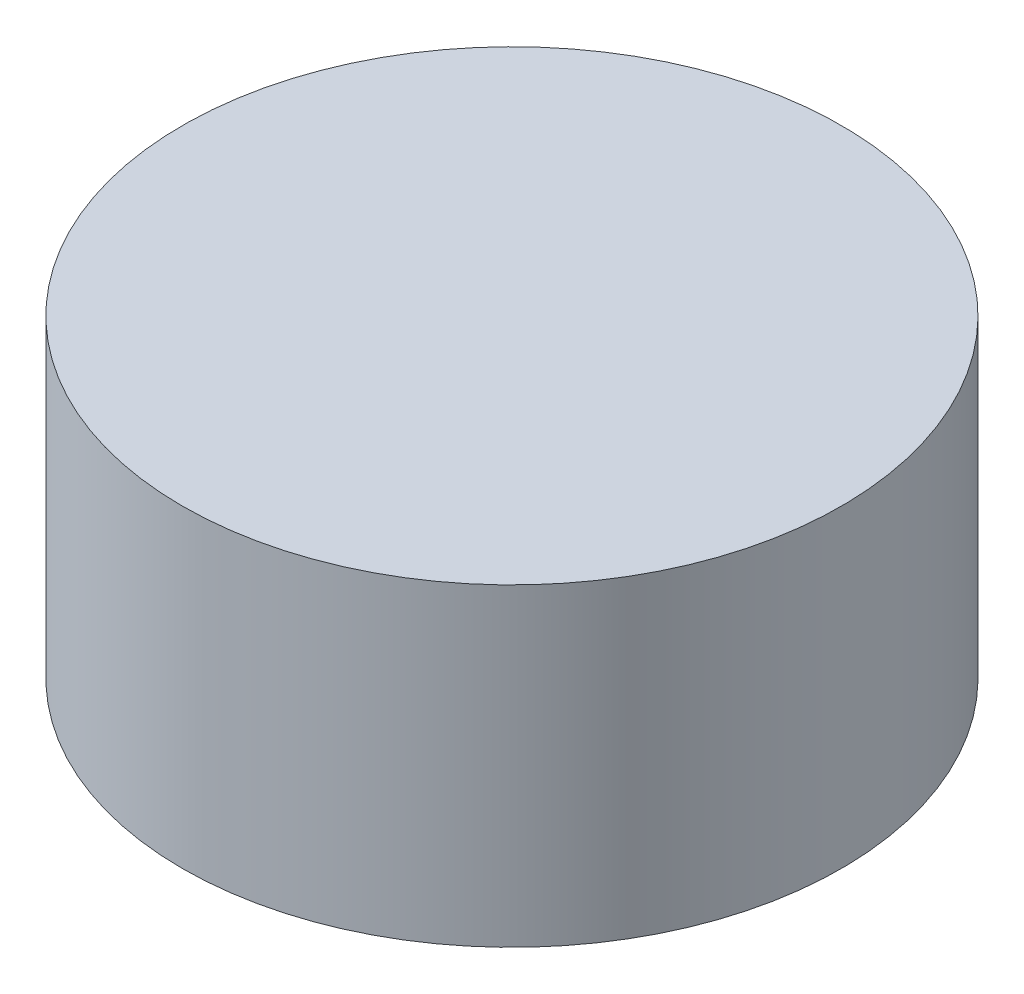
ISO-10303-21;
HEADER;
FILE_DESCRIPTION(('STEP AP214'),'2;1');
FILE_NAME('part.step','',(''),(''),'','','');
FILE_SCHEMA(('AUTOMOTIVE_DESIGN { 1 0 10303 214 1 1 1 1 }'));
ENDSEC;
DATA;
#1=APPLICATION_CONTEXT('core data for automotive mechanical design processes');
#2=APPLICATION_PROTOCOL_DEFINITION('international standard','automotive_design',2000,#1);
#3=PRODUCT_CONTEXT('',#1,'mechanical');
#4=PRODUCT('Part','Part','',(#3));
#5=PRODUCT_RELATED_PRODUCT_CATEGORY('part','',(#4));
#6=PRODUCT_DEFINITION_FORMATION('','',#4);
#7=PRODUCT_DEFINITION_CONTEXT('part definition',#1,'design');
#8=PRODUCT_DEFINITION('design','',#6,#7);
#9=PRODUCT_DEFINITION_SHAPE('','',#8);
#10=(LENGTH_UNIT() NAMED_UNIT(*) SI_UNIT(.MILLI.,.METRE.));
#11=(NAMED_UNIT(*) PLANE_ANGLE_UNIT() SI_UNIT($,.RADIAN.));
#12=(NAMED_UNIT(*) SI_UNIT($,.STERADIAN.) SOLID_ANGLE_UNIT());
#13=UNCERTAINTY_MEASURE_WITH_UNIT(LENGTH_MEASURE(1.E-05),#10,'distance_accuracy_value','');
#14=(GEOMETRIC_REPRESENTATION_CONTEXT(3) GLOBAL_UNCERTAINTY_ASSIGNED_CONTEXT((#13)) GLOBAL_UNIT_ASSIGNED_CONTEXT((#10,
#11,#12)) REPRESENTATION_CONTEXT('',''));
#15=CARTESIAN_POINT('',(0.,0.,0.));
#16=DIRECTION('',(0.,0.,1.));
#17=DIRECTION('',(1.,0.,0.));
#18=AXIS2_PLACEMENT_3D('',#15,#16,#17);
#19=CARTESIAN_POINT('',(0.,10.,0.));
#20=DIRECTION('',(0.,-1.,0.));
#21=DIRECTION('',(0.,0.,-1.));
#22=AXIS2_PLACEMENT_3D('',#19,#20,#21);
#23=CYLINDRICAL_SURFACE('',#22,10.5);
#24=CARTESIAN_POINT('',(0.,10.,0.));
#25=DIRECTION('',(0.,1.,0.));
#26=DIRECTION('',(0.,0.,1.));
#27=AXIS2_PLACEMENT_3D('',#24,#25,#26);
#28=CIRCLE('',#27,10.5);
#29=CARTESIAN_POINT('',(0.,10.,10.5));
#30=VERTEX_POINT('',#29);
#31=EDGE_CURVE('E10',#30,#30,#28,.T.);
#32=ORIENTED_EDGE('',*,*,#31,.F.);
#33=EDGE_LOOP('',(#32));
#34=FACE_BOUND('',#33,.T.);
#35=CARTESIAN_POINT('',(0.,0.,0.));
#36=DIRECTION('',(0.,1.,0.));
#37=DIRECTION('',(0.,0.,1.));
#38=AXIS2_PLACEMENT_3D('',#35,#36,#37);
#39=CIRCLE('',#38,10.5);
#40=CARTESIAN_POINT('',(0.,0.,10.5));
#41=VERTEX_POINT('',#40);
#42=EDGE_CURVE('E34',#41,#41,#39,.T.);
#43=ORIENTED_EDGE('',*,*,#42,.T.);
#44=EDGE_LOOP('',(#43));
#45=FACE_BOUND('',#44,.T.);
#46=ADVANCED_FACE('F31',(#34,#45),#23,.T.);
#47=CARTESIAN_POINT('',(0.,10.,0.));
#48=DIRECTION('',(0.,1.,0.));
#49=DIRECTION('',(0.,0.,1.));
#50=AXIS2_PLACEMENT_3D('',#47,#48,#49);
#51=PLANE('',#50);
#52=ORIENTED_EDGE('',*,*,#31,.T.);
#53=EDGE_LOOP('',(#52));
#54=FACE_BOUND('',#53,.T.);
#55=ADVANCED_FACE('F46',(#54),#51,.T.);
#56=CARTESIAN_POINT('',(0.,0.,0.));
#57=DIRECTION('',(0.,1.,0.));
#58=DIRECTION('',(0.,0.,1.));
#59=AXIS2_PLACEMENT_3D('',#56,#57,#58);
#60=PLANE('',#59);
#61=ORIENTED_EDGE('',*,*,#42,.F.);
#62=EDGE_LOOP('',(#61));
#63=FACE_BOUND('',#62,.T.);
#64=ADVANCED_FACE('F44',(#63),#60,.F.);
#65=CLOSED_SHELL('',(#46,#55,#64));
#66=MANIFOLD_SOLID_BREP('B2',#65);
#67=ADVANCED_BREP_SHAPE_REPRESENTATION('',(#18,#66),#14);
#68=SHAPE_DEFINITION_REPRESENTATION(#9,#67);
ENDSEC;
END-ISO-10303-21;
